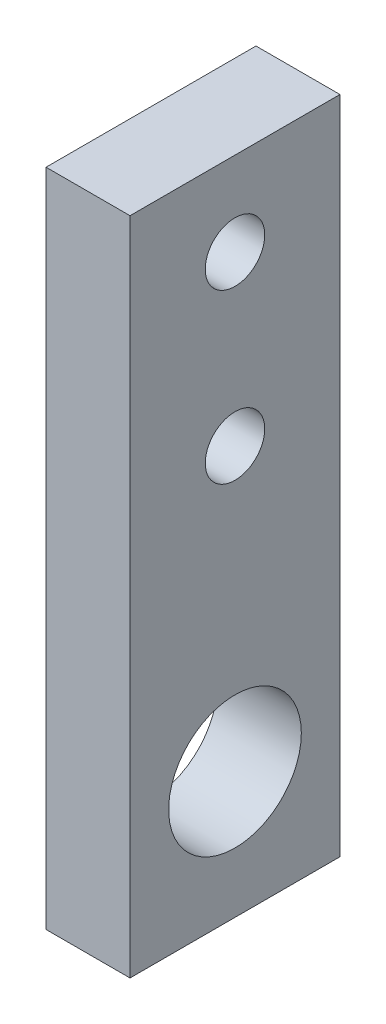
ISO-10303-21;
HEADER;
FILE_DESCRIPTION(('STEP AP214'),'2;1');
FILE_NAME('part.step','',(''),(''),'','','');
FILE_SCHEMA(('AUTOMOTIVE_DESIGN { 1 0 10303 214 1 1 1 1 }'));
ENDSEC;
DATA;
#1=APPLICATION_CONTEXT('core data for automotive mechanical design processes');
#2=APPLICATION_PROTOCOL_DEFINITION('international standard','automotive_design',2000,#1);
#3=PRODUCT_CONTEXT('',#1,'mechanical');
#4=PRODUCT('Part','Part','',(#3));
#5=PRODUCT_RELATED_PRODUCT_CATEGORY('part','',(#4));
#6=PRODUCT_DEFINITION_FORMATION('','',#4);
#7=PRODUCT_DEFINITION_CONTEXT('part definition',#1,'design');
#8=PRODUCT_DEFINITION('design','',#6,#7);
#9=PRODUCT_DEFINITION_SHAPE('','',#8);
#10=(LENGTH_UNIT() NAMED_UNIT(*) SI_UNIT(.MILLI.,.METRE.));
#11=(NAMED_UNIT(*) PLANE_ANGLE_UNIT() SI_UNIT($,.RADIAN.));
#12=(NAMED_UNIT(*) SI_UNIT($,.STERADIAN.) SOLID_ANGLE_UNIT());
#13=UNCERTAINTY_MEASURE_WITH_UNIT(LENGTH_MEASURE(1.E-05),#10,'distance_accuracy_value','');
#14=(GEOMETRIC_REPRESENTATION_CONTEXT(3) GLOBAL_UNCERTAINTY_ASSIGNED_CONTEXT((#13)) GLOBAL_UNIT_ASSIGNED_CONTEXT((#10,
#11,#12)) REPRESENTATION_CONTEXT('',''));
#15=CARTESIAN_POINT('',(0.,0.,0.));
#16=DIRECTION('',(0.,0.,1.));
#17=DIRECTION('',(1.,0.,0.));
#18=AXIS2_PLACEMENT_3D('',#15,#16,#17);
#19=CARTESIAN_POINT('',(40.64,-24.530132824,10.475));
#20=DIRECTION('',(-1.,0.,0.));
#21=DIRECTION('',(0.,0.,1.));
#22=AXIS2_PLACEMENT_3D('',#19,#20,#21);
#23=PLANE('',#22);
#24=CARTESIAN_POINT('',(40.64,-14.96,16.825));
#25=DIRECTION('',(-1.,0.,0.));
#26=DIRECTION('',(0.,0.,1.));
#27=AXIS2_PLACEMENT_3D('',#24,#25,#26);
#28=CIRCLE('',#27,5.0165);
#29=CARTESIAN_POINT('',(40.64,-14.96,11.8085));
#30=VERTEX_POINT('',#29);
#31=EDGE_CURVE('E106',#30,#30,#28,.F.);
#32=ORIENTED_EDGE('',*,*,#31,.T.);
#33=EDGE_LOOP('',(#32));
#34=FACE_BOUND('',#33,.T.);
#35=CARTESIAN_POINT('',(40.64,6.35,16.825));
#36=DIRECTION('',(-1.,0.,0.));
#37=DIRECTION('',(0.,0.,1.));
#38=AXIS2_PLACEMENT_3D('',#35,#36,#37);
#39=CIRCLE('',#38,2.2479);
#40=CARTESIAN_POINT('',(40.64,6.35,19.0729));
#41=VERTEX_POINT('',#40);
#42=EDGE_CURVE('E116',#41,#41,#39,.T.);
#43=ORIENTED_EDGE('',*,*,#42,.F.);
#44=EDGE_LOOP('',(#43));
#45=FACE_BOUND('',#44,.T.);
#46=CARTESIAN_POINT('',(40.64,19.05,16.825));
#47=DIRECTION('',(-1.,0.,0.));
#48=DIRECTION('',(0.,0.,1.));
#49=AXIS2_PLACEMENT_3D('',#46,#47,#48);
#50=CIRCLE('',#49,2.2479);
#51=CARTESIAN_POINT('',(40.64,19.05,19.0729));
#52=VERTEX_POINT('',#51);
#53=EDGE_CURVE('E122',#52,#52,#50,.T.);
#54=ORIENTED_EDGE('',*,*,#53,.F.);
#55=EDGE_LOOP('',(#54));
#56=FACE_BOUND('',#55,.T.);
#57=DIRECTION('',(0.,0.,-1.));
#58=VECTOR('',#57,1.);
#59=CARTESIAN_POINT('',(40.64,-24.520132824,10.475));
#60=LINE('',#59,#58);
#61=CARTESIAN_POINT('',(40.64,-24.520132824,24.7625));
#62=VERTEX_POINT('',#61);
#63=CARTESIAN_POINT('',(40.64,-24.520132824,8.88749999999998));
#64=VERTEX_POINT('',#63);
#65=EDGE_CURVE('E11',#62,#64,#60,.T.);
#66=ORIENTED_EDGE('',*,*,#65,.F.);
#67=DIRECTION('',(0.,-1.,0.));
#68=VECTOR('',#67,1.);
#69=CARTESIAN_POINT('',(40.64,25.4,24.7625));
#70=LINE('',#69,#68);
#71=CARTESIAN_POINT('',(40.64,25.4,24.7625));
#72=VERTEX_POINT('',#71);
#73=EDGE_CURVE('E99',#72,#62,#70,.T.);
#74=ORIENTED_EDGE('',*,*,#73,.F.);
#75=DIRECTION('',(0.,0.,-1.));
#76=VECTOR('',#75,1.);
#77=CARTESIAN_POINT('',(40.64,25.4,0.));
#78=LINE('',#77,#76);
#79=CARTESIAN_POINT('',(40.64,25.4,8.88749999999999));
#80=VERTEX_POINT('',#79);
#81=EDGE_CURVE('E39',#72,#80,#78,.T.);
#82=ORIENTED_EDGE('',*,*,#81,.T.);
#83=DIRECTION('',(0.,1.,0.));
#84=VECTOR('',#83,1.);
#85=CARTESIAN_POINT('',(40.64,25.4,8.88749999999999));
#86=LINE('',#85,#84);
#87=EDGE_CURVE('E89',#64,#80,#86,.T.);
#88=ORIENTED_EDGE('',*,*,#87,.F.);
#89=EDGE_LOOP('',(#66,#74,#82,#88));
#90=FACE_BOUND('',#89,.T.);
#91=ADVANCED_FACE('F35',(#34,#45,#56,#90),#23,.T.);
#92=CARTESIAN_POINT('',(0.,25.4,0.));
#93=DIRECTION('',(0.,-1.,0.));
#94=DIRECTION('',(0.,0.,-1.));
#95=AXIS2_PLACEMENT_3D('',#92,#93,#94);
#96=PLANE('',#95);
#97=ORIENTED_EDGE('',*,*,#81,.F.);
#98=DIRECTION('',(1.,0.,0.));
#99=VECTOR('',#98,1.);
#100=CARTESIAN_POINT('',(40.64,25.4,24.7625));
#101=LINE('',#100,#99);
#102=CARTESIAN_POINT('',(46.99,25.4,24.7625));
#103=VERTEX_POINT('',#102);
#104=EDGE_CURVE('E81',#72,#103,#101,.T.);
#105=ORIENTED_EDGE('',*,*,#104,.T.);
#106=DIRECTION('',(0.,0.,1.));
#107=VECTOR('',#106,1.);
#108=CARTESIAN_POINT('',(46.99,25.4,23.175));
#109=LINE('',#108,#107);
#110=CARTESIAN_POINT('',(46.99,25.4,8.88749999999999));
#111=VERTEX_POINT('',#110);
#112=EDGE_CURVE('E64',#111,#103,#109,.T.);
#113=ORIENTED_EDGE('',*,*,#112,.F.);
#114=DIRECTION('',(1.,0.,0.));
#115=VECTOR('',#114,1.);
#116=CARTESIAN_POINT('',(40.64,25.4,8.88749999999999));
#117=LINE('',#116,#115);
#118=EDGE_CURVE('E78',#80,#111,#117,.T.);
#119=ORIENTED_EDGE('',*,*,#118,.F.);
#120=EDGE_LOOP('',(#97,#105,#113,#119));
#121=FACE_BOUND('',#120,.T.);
#122=ADVANCED_FACE('F37',(#121),#96,.F.);
#123=CARTESIAN_POINT('',(46.99,0.,0.));
#124=DIRECTION('',(-1.,0.,0.));
#125=DIRECTION('',(0.,0.,1.));
#126=AXIS2_PLACEMENT_3D('',#123,#124,#125);
#127=PLANE('',#126);
#128=CARTESIAN_POINT('',(46.99,-14.96,16.825));
#129=DIRECTION('',(1.,0.,0.));
#130=DIRECTION('',(0.,0.,-1.));
#131=AXIS2_PLACEMENT_3D('',#128,#129,#130);
#132=CIRCLE('',#131,5.0165);
#133=CARTESIAN_POINT('',(46.99,-14.96,11.8085));
#134=VERTEX_POINT('',#133);
#135=EDGE_CURVE('E108',#134,#134,#132,.T.);
#136=ORIENTED_EDGE('',*,*,#135,.F.);
#137=EDGE_LOOP('',(#136));
#138=FACE_BOUND('',#137,.T.);
#139=CARTESIAN_POINT('',(46.99,6.35,16.825));
#140=DIRECTION('',(-1.,0.,0.));
#141=DIRECTION('',(0.,0.,1.));
#142=AXIS2_PLACEMENT_3D('',#139,#140,#141);
#143=CIRCLE('',#142,2.2479);
#144=CARTESIAN_POINT('',(46.99,6.35,19.0729));
#145=VERTEX_POINT('',#144);
#146=EDGE_CURVE('E111',#145,#145,#143,.T.);
#147=ORIENTED_EDGE('',*,*,#146,.T.);
#148=EDGE_LOOP('',(#147));
#149=FACE_BOUND('',#148,.T.);
#150=CARTESIAN_POINT('',(46.99,19.05,16.825));
#151=DIRECTION('',(-1.,0.,0.));
#152=DIRECTION('',(0.,0.,1.));
#153=AXIS2_PLACEMENT_3D('',#150,#151,#152);
#154=CIRCLE('',#153,2.2479);
#155=CARTESIAN_POINT('',(46.99,19.05,19.0729));
#156=VERTEX_POINT('',#155);
#157=EDGE_CURVE('E119',#156,#156,#154,.T.);
#158=ORIENTED_EDGE('',*,*,#157,.T.);
#159=EDGE_LOOP('',(#158));
#160=FACE_BOUND('',#159,.T.);
#161=DIRECTION('',(0.,0.,-1.));
#162=VECTOR('',#161,1.);
#163=CARTESIAN_POINT('',(46.99,-24.520132824,10.475));
#164=LINE('',#163,#162);
#165=CARTESIAN_POINT('',(46.99,-24.520132824,24.7625));
#166=VERTEX_POINT('',#165);
#167=CARTESIAN_POINT('',(46.99,-24.520132824,8.88749999999998));
#168=VERTEX_POINT('',#167);
#169=EDGE_CURVE('E45',#166,#168,#164,.T.);
#170=ORIENTED_EDGE('',*,*,#169,.T.);
#171=DIRECTION('',(0.,1.,0.));
#172=VECTOR('',#171,1.);
#173=CARTESIAN_POINT('',(46.99,25.4,8.88749999999999));
#174=LINE('',#173,#172);
#175=EDGE_CURVE('E88',#168,#111,#174,.T.);
#176=ORIENTED_EDGE('',*,*,#175,.T.);
#177=ORIENTED_EDGE('',*,*,#112,.T.);
#178=DIRECTION('',(0.,-1.,0.));
#179=VECTOR('',#178,1.);
#180=CARTESIAN_POINT('',(46.99,25.4,24.7625));
#181=LINE('',#180,#179);
#182=EDGE_CURVE('E90',#103,#166,#181,.T.);
#183=ORIENTED_EDGE('',*,*,#182,.T.);
#184=EDGE_LOOP('',(#170,#176,#177,#183));
#185=FACE_BOUND('',#184,.T.);
#186=ADVANCED_FACE('F93',(#138,#149,#160,#185),#127,.F.);
#187=CARTESIAN_POINT('',(46.99,-24.520132824,10.475));
#188=DIRECTION('',(0.,1.,0.));
#189=DIRECTION('',(0.,0.,1.));
#190=AXIS2_PLACEMENT_3D('',#187,#188,#189);
#191=PLANE('',#190);
#192=ORIENTED_EDGE('',*,*,#65,.T.);
#193=DIRECTION('',(1.,0.,0.));
#194=VECTOR('',#193,1.);
#195=CARTESIAN_POINT('',(40.64,-24.520132824,8.88749999999998));
#196=LINE('',#195,#194);
#197=EDGE_CURVE('E91',#64,#168,#196,.T.);
#198=ORIENTED_EDGE('',*,*,#197,.T.);
#199=ORIENTED_EDGE('',*,*,#169,.F.);
#200=DIRECTION('',(1.,0.,0.));
#201=VECTOR('',#200,1.);
#202=CARTESIAN_POINT('',(40.64,-24.520132824,24.7625));
#203=LINE('',#202,#201);
#204=EDGE_CURVE('E103',#62,#166,#203,.T.);
#205=ORIENTED_EDGE('',*,*,#204,.F.);
#206=EDGE_LOOP('',(#192,#198,#199,#205));
#207=FACE_BOUND('',#206,.T.);
#208=ADVANCED_FACE('F130',(#207),#191,.F.);
#209=CARTESIAN_POINT('',(-40.64,19.05,16.825));
#210=DIRECTION('',(1.,0.,0.));
#211=DIRECTION('',(0.,0.,1.));
#212=AXIS2_PLACEMENT_3D('',#209,#210,#211);
#213=CYLINDRICAL_SURFACE('',#212,2.2479);
#214=ORIENTED_EDGE('',*,*,#157,.F.);
#215=EDGE_LOOP('',(#214));
#216=FACE_BOUND('',#215,.T.);
#217=ORIENTED_EDGE('',*,*,#53,.T.);
#218=EDGE_LOOP('',(#217));
#219=FACE_BOUND('',#218,.T.);
#220=ADVANCED_FACE('F126',(#216,#219),#213,.F.);
#221=CARTESIAN_POINT('',(-40.64,6.35,16.825));
#222=DIRECTION('',(1.,0.,0.));
#223=DIRECTION('',(0.,0.,1.));
#224=AXIS2_PLACEMENT_3D('',#221,#222,#223);
#225=CYLINDRICAL_SURFACE('',#224,2.2479);
#226=ORIENTED_EDGE('',*,*,#146,.F.);
#227=EDGE_LOOP('',(#226));
#228=FACE_BOUND('',#227,.T.);
#229=ORIENTED_EDGE('',*,*,#42,.T.);
#230=EDGE_LOOP('',(#229));
#231=FACE_BOUND('',#230,.T.);
#232=ADVANCED_FACE('F138',(#228,#231),#225,.F.);
#233=CARTESIAN_POINT('',(40.639,-14.96,16.825));
#234=DIRECTION('',(1.,0.,0.));
#235=DIRECTION('',(0.,0.,-1.));
#236=AXIS2_PLACEMENT_3D('',#233,#234,#235);
#237=CYLINDRICAL_SURFACE('',#236,5.0165);
#238=CARTESIAN_POINT('',(40.64,-14.96,11.8085));
#239=CARTESIAN_POINT('',(40.7061458333333,-14.96,11.8085));
#240=CARTESIAN_POINT('',(40.7722916666667,-14.96,11.8085));
#241=CARTESIAN_POINT('',(40.9045833333333,-14.96,11.8085));
#242=CARTESIAN_POINT('',(40.9707291666667,-14.96,11.8085));
#243=CARTESIAN_POINT('',(41.1030208333333,-14.96,11.8085));
#244=CARTESIAN_POINT('',(41.1691666666667,-14.96,11.8085));
#245=CARTESIAN_POINT('',(41.3014583333333,-14.96,11.8085));
#246=CARTESIAN_POINT('',(41.3676041666667,-14.96,11.8085));
#247=CARTESIAN_POINT('',(41.4998958333333,-14.96,11.8085));
#248=CARTESIAN_POINT('',(41.5660416666667,-14.96,11.8085));
#249=CARTESIAN_POINT('',(41.6983333333333,-14.96,11.8085));
#250=CARTESIAN_POINT('',(41.7644791666667,-14.96,11.8085));
#251=CARTESIAN_POINT('',(41.8967708333333,-14.96,11.8085));
#252=CARTESIAN_POINT('',(41.9629166666667,-14.96,11.8085));
#253=CARTESIAN_POINT('',(42.0952083333333,-14.96,11.8085));
#254=CARTESIAN_POINT('',(42.1613541666667,-14.96,11.8085));
#255=CARTESIAN_POINT('',(42.2936458333333,-14.96,11.8085));
#256=CARTESIAN_POINT('',(42.3597916666667,-14.96,11.8085));
#257=CARTESIAN_POINT('',(42.4920833333333,-14.96,11.8085));
#258=CARTESIAN_POINT('',(42.5582291666667,-14.96,11.8085));
#259=CARTESIAN_POINT('',(42.6905208333333,-14.96,11.8085));
#260=CARTESIAN_POINT('',(42.7566666666667,-14.96,11.8085));
#261=CARTESIAN_POINT('',(42.8889583333333,-14.96,11.8085));
#262=CARTESIAN_POINT('',(42.9551041666667,-14.96,11.8085));
#263=CARTESIAN_POINT('',(43.0873958333333,-14.96,11.8085));
#264=CARTESIAN_POINT('',(43.1535416666667,-14.96,11.8085));
#265=CARTESIAN_POINT('',(43.2858333333333,-14.96,11.8085));
#266=CARTESIAN_POINT('',(43.3519791666667,-14.96,11.8085));
#267=CARTESIAN_POINT('',(43.4842708333333,-14.96,11.8085));
#268=CARTESIAN_POINT('',(43.5504166666667,-14.96,11.8085));
#269=CARTESIAN_POINT('',(43.6827083333333,-14.96,11.8085));
#270=CARTESIAN_POINT('',(43.7488541666667,-14.96,11.8085));
#271=CARTESIAN_POINT('',(43.8811458333333,-14.96,11.8085));
#272=CARTESIAN_POINT('',(43.9472916666667,-14.96,11.8085));
#273=CARTESIAN_POINT('',(44.0795833333333,-14.96,11.8085));
#274=CARTESIAN_POINT('',(44.1457291666667,-14.96,11.8085));
#275=CARTESIAN_POINT('',(44.2780208333333,-14.96,11.8085));
#276=CARTESIAN_POINT('',(44.3441666666667,-14.96,11.8085));
#277=CARTESIAN_POINT('',(44.4764583333333,-14.96,11.8085));
#278=CARTESIAN_POINT('',(44.5426041666667,-14.96,11.8085));
#279=CARTESIAN_POINT('',(44.6748958333333,-14.96,11.8085));
#280=CARTESIAN_POINT('',(44.7410416666667,-14.96,11.8085));
#281=CARTESIAN_POINT('',(44.8733333333333,-14.96,11.8085));
#282=CARTESIAN_POINT('',(44.9394791666667,-14.96,11.8085));
#283=CARTESIAN_POINT('',(45.0717708333333,-14.96,11.8085));
#284=CARTESIAN_POINT('',(45.1379166666667,-14.96,11.8085));
#285=CARTESIAN_POINT('',(45.2702083333333,-14.96,11.8085));
#286=CARTESIAN_POINT('',(45.3363541666667,-14.96,11.8085));
#287=CARTESIAN_POINT('',(45.4686458333333,-14.96,11.8085));
#288=CARTESIAN_POINT('',(45.5347916666667,-14.96,11.8085));
#289=CARTESIAN_POINT('',(45.6670833333333,-14.96,11.8085));
#290=CARTESIAN_POINT('',(45.7332291666667,-14.96,11.8085));
#291=CARTESIAN_POINT('',(45.8655208333333,-14.96,11.8085));
#292=CARTESIAN_POINT('',(45.9316666666667,-14.96,11.8085));
#293=CARTESIAN_POINT('',(46.0639583333333,-14.96,11.8085));
#294=CARTESIAN_POINT('',(46.1301041666667,-14.96,11.8085));
#295=CARTESIAN_POINT('',(46.2623958333333,-14.96,11.8085));
#296=CARTESIAN_POINT('',(46.3285416666667,-14.96,11.8085));
#297=CARTESIAN_POINT('',(46.4608333333333,-14.96,11.8085));
#298=CARTESIAN_POINT('',(46.5269791666667,-14.96,11.8085));
#299=CARTESIAN_POINT('',(46.6592708333333,-14.96,11.8085));
#300=CARTESIAN_POINT('',(46.7254166666667,-14.96,11.8085));
#301=CARTESIAN_POINT('',(46.8577083333333,-14.96,11.8085));
#302=CARTESIAN_POINT('',(46.9238541666667,-14.96,11.8085));
#303=CARTESIAN_POINT('',(46.99,-14.96,11.8085));
#304=B_SPLINE_CURVE_WITH_KNOTS('',3,(#238,#239,#240,#241,#242,#243,#244,#245,#246,#247,#248,
#249,#250,#251,#252,#253,#254,#255,#256,#257,#258,#259,#260,#261,#262,#263,#264,#265,#266,#267,
#268,#269,#270,#271,#272,#273,#274,#275,#276,#277,#278,#279,#280,#281,#282,#283,#284,#285,#286,
#287,#288,#289,#290,#291,#292,#293,#294,#295,#296,#297,#298,#299,#300,#301,#302,#303),
.UNSPECIFIED.,.F.,.F.,(4,2,2,2,2,2,2,2,2,2,2,2,2,2,2,2,2,2,2,2,2,2,2,2,2,2,2,2,2,2,2,2,4),(0.,
0.198437499999995,0.396874999999998,0.595312499999993,0.793749999999996,0.992187499999998,
1.19062499999999,1.3890625,1.5875,1.78593749999999,1.984375,2.18281249999999,2.38124999999999,
2.5796875,2.77812499999999,2.97656249999999,3.175,3.37343749999999,3.571875,3.77031249999999,
3.96874999999999,4.1671875,4.36562499999999,4.56406249999999,4.7625,4.96093749999999,
5.15937499999999,5.3578125,5.55624999999999,5.75468749999999,5.95312499999999,6.15156249999999,
6.34999999999999),.UNSPECIFIED.);
#305=EDGE_CURVE('BSEAM151',#30,#134,#304,.T.);
#306=ORIENTED_EDGE('',*,*,#31,.F.);
#307=ORIENTED_EDGE('',*,*,#135,.T.);
#308=ORIENTED_EDGE('',*,*,#305,.T.);
#309=ORIENTED_EDGE('',*,*,#305,.F.);
#310=EDGE_LOOP('',(#306,#308,#307,#309));
#311=FACE_BOUND('',#310,.T.);
#312=ADVANCED_FACE('F151',(#311),#237,.F.);
#313=CARTESIAN_POINT('',(40.64,25.4,24.7625));
#314=DIRECTION('',(0.,0.,1.));
#315=DIRECTION('',(0.,-1.,0.));
#316=AXIS2_PLACEMENT_3D('',#313,#314,#315);
#317=PLANE('',#316);
#318=ORIENTED_EDGE('',*,*,#182,.F.);
#319=ORIENTED_EDGE('',*,*,#104,.F.);
#320=ORIENTED_EDGE('',*,*,#73,.T.);
#321=ORIENTED_EDGE('',*,*,#204,.T.);
#322=EDGE_LOOP('',(#318,#319,#320,#321));
#323=FACE_BOUND('',#322,.T.);
#324=ADVANCED_FACE('F154',(#323),#317,.T.);
#325=CARTESIAN_POINT('',(40.64,25.4,8.88749999999999));
#326=DIRECTION('',(0.,0.,-1.));
#327=DIRECTION('',(0.,1.,0.));
#328=AXIS2_PLACEMENT_3D('',#325,#326,#327);
#329=PLANE('',#328);
#330=ORIENTED_EDGE('',*,*,#175,.F.);
#331=ORIENTED_EDGE('',*,*,#197,.F.);
#332=ORIENTED_EDGE('',*,*,#87,.T.);
#333=ORIENTED_EDGE('',*,*,#118,.T.);
#334=EDGE_LOOP('',(#330,#331,#332,#333));
#335=FACE_BOUND('',#334,.T.);
#336=ADVANCED_FACE('F86',(#335),#329,.T.);
#337=CLOSED_SHELL('',(#91,#122,#186,#208,#220,#232,#312,#324,#336));
#338=MANIFOLD_SOLID_BREP('B2',#337);
#339=ADVANCED_BREP_SHAPE_REPRESENTATION('',(#18,#338),#14);
#340=SHAPE_DEFINITION_REPRESENTATION(#9,#339);
ENDSEC;
END-ISO-10303-21;
